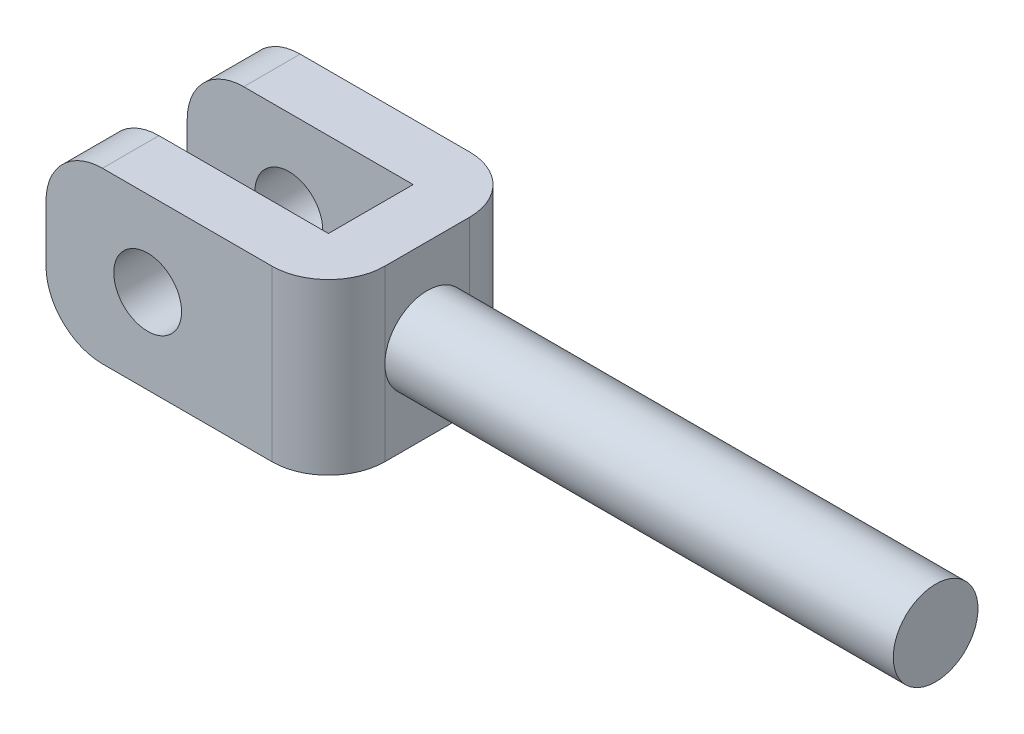
ISO-10303-21;
HEADER;
FILE_DESCRIPTION(('STEP AP214'),'2;1');
FILE_NAME('part.step','',(''),(''),'','','');
FILE_SCHEMA(('AUTOMOTIVE_DESIGN { 1 0 10303 214 1 1 1 1 }'));
ENDSEC;
DATA;
#1=APPLICATION_CONTEXT('core data for automotive mechanical design processes');
#2=APPLICATION_PROTOCOL_DEFINITION('international standard','automotive_design',2000,#1);
#3=PRODUCT_CONTEXT('',#1,'mechanical');
#4=PRODUCT('Part','Part','',(#3));
#5=PRODUCT_RELATED_PRODUCT_CATEGORY('part','',(#4));
#6=PRODUCT_DEFINITION_FORMATION('','',#4);
#7=PRODUCT_DEFINITION_CONTEXT('part definition',#1,'design');
#8=PRODUCT_DEFINITION('design','',#6,#7);
#9=PRODUCT_DEFINITION_SHAPE('','',#8);
#10=(LENGTH_UNIT() NAMED_UNIT(*) SI_UNIT(.MILLI.,.METRE.));
#11=(NAMED_UNIT(*) PLANE_ANGLE_UNIT() SI_UNIT($,.RADIAN.));
#12=(NAMED_UNIT(*) SI_UNIT($,.STERADIAN.) SOLID_ANGLE_UNIT());
#13=UNCERTAINTY_MEASURE_WITH_UNIT(LENGTH_MEASURE(1.E-05),#10,'distance_accuracy_value','');
#14=(GEOMETRIC_REPRESENTATION_CONTEXT(3) GLOBAL_UNCERTAINTY_ASSIGNED_CONTEXT((#13)) GLOBAL_UNIT_ASSIGNED_CONTEXT((#10,
#11,#12)) REPRESENTATION_CONTEXT('',''));
#15=CARTESIAN_POINT('',(0.,0.,0.));
#16=DIRECTION('',(0.,0.,1.));
#17=DIRECTION('',(1.,0.,0.));
#18=AXIS2_PLACEMENT_3D('',#15,#16,#17);
#19=CARTESIAN_POINT('',(1.,-1.5,-1.75));
#20=DIRECTION('',(1.,0.,0.));
#21=DIRECTION('',(0.,0.,-1.));
#22=AXIS2_PLACEMENT_3D('',#19,#20,#21);
#23=PLANE('',#22);
#24=DIRECTION('',(0.,0.,-1.));
#25=VECTOR('',#24,1.);
#26=CARTESIAN_POINT('',(1.,-1.5,-1.75));
#27=LINE('',#26,#25);
#28=CARTESIAN_POINT('',(1.,-1.5,0.75));
#29=VERTEX_POINT('',#28);
#30=CARTESIAN_POINT('',(1.,-1.5,-0.75));
#31=VERTEX_POINT('',#30);
#32=EDGE_CURVE('E212',#29,#31,#27,.T.);
#33=ORIENTED_EDGE('',*,*,#32,.T.);
#34=DIRECTION('',(0.,1.,0.));
#35=VECTOR('',#34,1.);
#36=CARTESIAN_POINT('',(1.,-1.5,-0.75));
#37=LINE('',#36,#35);
#38=CARTESIAN_POINT('',(0.999999999999999,0.,-0.75));
#39=VERTEX_POINT('',#38);
#40=EDGE_CURVE('E11',#31,#39,#37,.T.);
#41=ORIENTED_EDGE('',*,*,#40,.T.);
#42=CARTESIAN_POINT('',(0.999999999999999,0.,0.));
#43=DIRECTION('',(1.,0.,0.));
#44=DIRECTION('',(0.,0.,-1.));
#45=AXIS2_PLACEMENT_3D('',#42,#43,#44);
#46=CIRCLE('',#45,0.75);
#47=CARTESIAN_POINT('',(0.999999999999999,0.,0.75));
#48=VERTEX_POINT('',#47);
#49=EDGE_CURVE('E223',#48,#39,#46,.T.);
#50=ORIENTED_EDGE('',*,*,#49,.F.);
#51=DIRECTION('',(0.,1.,0.));
#52=VECTOR('',#51,1.);
#53=CARTESIAN_POINT('',(1.,-1.5,0.75));
#54=LINE('',#53,#52);
#55=EDGE_CURVE('E315',#48,#29,#54,.F.);
#56=ORIENTED_EDGE('',*,*,#55,.T.);
#57=EDGE_LOOP('',(#33,#41,#50,#56));
#58=FACE_BOUND('',#57,.T.);
#59=ADVANCED_FACE('F43',(#58),#23,.T.);
#60=CARTESIAN_POINT('',(10.,0.,0.));
#61=DIRECTION('',(-1.,0.,0.));
#62=DIRECTION('',(0.,0.,1.));
#63=AXIS2_PLACEMENT_3D('',#60,#61,#62);
#64=CYLINDRICAL_SURFACE('',#63,0.75);
#65=EDGE_CURVE('E243',#39,#48,#46,.T.);
#66=ORIENTED_EDGE('',*,*,#65,.T.);
#67=ORIENTED_EDGE('',*,*,#49,.T.);
#68=EDGE_LOOP('',(#66,#67));
#69=FACE_BOUND('',#68,.T.);
#70=CARTESIAN_POINT('',(10.,0.,0.));
#71=DIRECTION('',(1.,0.,0.));
#72=DIRECTION('',(0.,0.,-1.));
#73=AXIS2_PLACEMENT_3D('',#70,#71,#72);
#74=CIRCLE('',#73,0.75);
#75=CARTESIAN_POINT('',(10.,0.,-0.75));
#76=VERTEX_POINT('',#75);
#77=EDGE_CURVE('E238',#76,#76,#74,.T.);
#78=ORIENTED_EDGE('',*,*,#77,.F.);
#79=EDGE_LOOP('',(#78));
#80=FACE_BOUND('',#79,.T.);
#81=ADVANCED_FACE('F357',(#69,#80),#64,.T.);
#82=CARTESIAN_POINT('',(10.,0.,0.));
#83=DIRECTION('',(1.,0.,0.));
#84=DIRECTION('',(0.,0.,-1.));
#85=AXIS2_PLACEMENT_3D('',#82,#83,#84);
#86=PLANE('',#85);
#87=ORIENTED_EDGE('',*,*,#77,.T.);
#88=EDGE_LOOP('',(#87));
#89=FACE_BOUND('',#88,.T.);
#90=ADVANCED_FACE('F364',(#89),#86,.T.);
#91=CARTESIAN_POINT('',(0.,-1.5,-0.75));
#92=DIRECTION('',(0.,0.,1.));
#93=DIRECTION('',(1.,0.,0.));
#94=AXIS2_PLACEMENT_3D('',#91,#92,#93);
#95=PLANE('',#94);
#96=CARTESIAN_POINT('',(-2.2,0.,-0.75));
#97=DIRECTION('',(0.,0.,1.));
#98=DIRECTION('',(1.,0.,0.));
#99=AXIS2_PLACEMENT_3D('',#96,#97,#98);
#100=CIRCLE('',#99,0.6);
#101=CARTESIAN_POINT('',(-1.6,0.,-0.75));
#102=VERTEX_POINT('',#101);
#103=EDGE_CURVE('E166',#102,#102,#100,.T.);
#104=ORIENTED_EDGE('',*,*,#103,.F.);
#105=EDGE_LOOP('',(#104));
#106=FACE_BOUND('',#105,.T.);
#107=DIRECTION('',(1.,0.,0.));
#108=VECTOR('',#107,1.);
#109=CARTESIAN_POINT('',(0.,1.5,-0.75));
#110=LINE('',#109,#108);
#111=CARTESIAN_POINT('',(-3.,1.5,-0.75));
#112=VERTEX_POINT('',#111);
#113=CARTESIAN_POINT('',(0.,1.5,-0.75));
#114=VERTEX_POINT('',#113);
#115=EDGE_CURVE('E154',#112,#114,#110,.T.);
#116=ORIENTED_EDGE('',*,*,#115,.F.);
#117=CARTESIAN_POINT('',(-3.,0.5,-0.75));
#118=DIRECTION('',(0.,0.,1.));
#119=DIRECTION('',(1.,0.,0.));
#120=AXIS2_PLACEMENT_3D('',#117,#118,#119);
#121=CIRCLE('',#120,1.);
#122=CARTESIAN_POINT('',(-4.,0.5,-0.75));
#123=VERTEX_POINT('',#122);
#124=EDGE_CURVE('E261',#112,#123,#121,.T.);
#125=ORIENTED_EDGE('',*,*,#124,.T.);
#126=DIRECTION('',(0.,1.,0.));
#127=VECTOR('',#126,1.);
#128=CARTESIAN_POINT('',(-4.,-1.5,-0.75));
#129=LINE('',#128,#127);
#130=CARTESIAN_POINT('',(-4.,-0.5,-0.75));
#131=VERTEX_POINT('',#130);
#132=EDGE_CURVE('E219',#131,#123,#129,.T.);
#133=ORIENTED_EDGE('',*,*,#132,.F.);
#134=CARTESIAN_POINT('',(-3.,-0.5,-0.75));
#135=DIRECTION('',(0.,0.,1.));
#136=DIRECTION('',(1.,0.,0.));
#137=AXIS2_PLACEMENT_3D('',#134,#135,#136);
#138=CIRCLE('',#137,1.);
#139=CARTESIAN_POINT('',(-3.,-1.5,-0.75));
#140=VERTEX_POINT('',#139);
#141=EDGE_CURVE('E258',#131,#140,#138,.T.);
#142=ORIENTED_EDGE('',*,*,#141,.T.);
#143=DIRECTION('',(1.,0.,0.));
#144=VECTOR('',#143,1.);
#145=CARTESIAN_POINT('',(0.,-1.5,-0.75));
#146=LINE('',#145,#144);
#147=CARTESIAN_POINT('',(0.,-1.5,-0.75));
#148=VERTEX_POINT('',#147);
#149=EDGE_CURVE('E172',#140,#148,#146,.T.);
#150=ORIENTED_EDGE('',*,*,#149,.T.);
#151=DIRECTION('',(0.,1.,0.));
#152=VECTOR('',#151,1.);
#153=CARTESIAN_POINT('',(0.,-1.5,-0.75));
#154=LINE('',#153,#152);
#155=EDGE_CURVE('E169',#148,#114,#154,.T.);
#156=ORIENTED_EDGE('',*,*,#155,.T.);
#157=EDGE_LOOP('',(#116,#125,#133,#142,#150,#156));
#158=FACE_BOUND('',#157,.T.);
#159=ADVANCED_FACE('F170',(#106,#158),#95,.T.);
#160=CARTESIAN_POINT('',(-4.,-1.5,-1.75));
#161=DIRECTION('',(-1.,0.,0.));
#162=DIRECTION('',(0.,0.,1.));
#163=AXIS2_PLACEMENT_3D('',#160,#161,#162);
#164=PLANE('',#163);
#165=ORIENTED_EDGE('',*,*,#132,.T.);
#166=DIRECTION('',(0.,0.,1.));
#167=VECTOR('',#166,1.);
#168=CARTESIAN_POINT('',(-4.,0.5,-1.75));
#169=LINE('',#168,#167);
#170=CARTESIAN_POINT('',(-4.,0.5,-1.75));
#171=VERTEX_POINT('',#170);
#172=EDGE_CURVE('E268',#123,#171,#169,.F.);
#173=ORIENTED_EDGE('',*,*,#172,.T.);
#174=DIRECTION('',(0.,1.,0.));
#175=VECTOR('',#174,1.);
#176=CARTESIAN_POINT('',(-4.,-1.5,-1.75));
#177=LINE('',#176,#175);
#178=CARTESIAN_POINT('',(-4.,-0.5,-1.75));
#179=VERTEX_POINT('',#178);
#180=EDGE_CURVE('E224',#179,#171,#177,.T.);
#181=ORIENTED_EDGE('',*,*,#180,.F.);
#182=DIRECTION('',(0.,0.,1.));
#183=VECTOR('',#182,1.);
#184=CARTESIAN_POINT('',(-4.,-0.5,-0.75));
#185=LINE('',#184,#183);
#186=EDGE_CURVE('E264',#179,#131,#185,.T.);
#187=ORIENTED_EDGE('',*,*,#186,.T.);
#188=EDGE_LOOP('',(#165,#173,#181,#187));
#189=FACE_BOUND('',#188,.T.);
#190=ADVANCED_FACE('F340',(#189),#164,.T.);
#191=CARTESIAN_POINT('',(1.,-1.5,-1.75));
#192=DIRECTION('',(0.,0.,-1.));
#193=DIRECTION('',(-1.,0.,0.));
#194=AXIS2_PLACEMENT_3D('',#191,#192,#193);
#195=PLANE('',#194);
#196=CARTESIAN_POINT('',(-2.2,0.,-1.75));
#197=DIRECTION('',(0.,0.,-1.));
#198=DIRECTION('',(-1.,0.,0.));
#199=AXIS2_PLACEMENT_3D('',#196,#197,#198);
#200=CIRCLE('',#199,0.6);
#201=CARTESIAN_POINT('',(-2.8,0.,-1.75));
#202=VERTEX_POINT('',#201);
#203=EDGE_CURVE('E408',#202,#202,#200,.T.);
#204=ORIENTED_EDGE('',*,*,#203,.F.);
#205=EDGE_LOOP('',(#204));
#206=FACE_BOUND('',#205,.T.);
#207=ORIENTED_EDGE('',*,*,#180,.T.);
#208=CARTESIAN_POINT('',(-3.,0.5,-1.75));
#209=DIRECTION('',(0.,0.,-1.));
#210=DIRECTION('',(-1.,0.,0.));
#211=AXIS2_PLACEMENT_3D('',#208,#209,#210);
#212=CIRCLE('',#211,1.);
#213=CARTESIAN_POINT('',(-3.,1.5,-1.75));
#214=VERTEX_POINT('',#213);
#215=EDGE_CURVE('E277',#171,#214,#212,.T.);
#216=ORIENTED_EDGE('',*,*,#215,.T.);
#217=DIRECTION('',(-1.,0.,0.));
#218=VECTOR('',#217,1.);
#219=CARTESIAN_POINT('',(1.,1.5,-1.75));
#220=LINE('',#219,#218);
#221=CARTESIAN_POINT('',(0.,1.5,-1.75));
#222=VERTEX_POINT('',#221);
#223=EDGE_CURVE('E196',#222,#214,#220,.T.);
#224=ORIENTED_EDGE('',*,*,#223,.F.);
#225=DIRECTION('',(0.,1.,0.));
#226=VECTOR('',#225,1.);
#227=CARTESIAN_POINT('',(0.,-1.5,-1.75));
#228=LINE('',#227,#226);
#229=CARTESIAN_POINT('',(0.,-1.5,-1.75));
#230=VERTEX_POINT('',#229);
#231=EDGE_CURVE('E271',#222,#230,#228,.F.);
#232=ORIENTED_EDGE('',*,*,#231,.T.);
#233=DIRECTION('',(-1.,0.,0.));
#234=VECTOR('',#233,1.);
#235=CARTESIAN_POINT('',(1.,-1.5,-1.75));
#236=LINE('',#235,#234);
#237=CARTESIAN_POINT('',(-3.,-1.5,-1.75));
#238=VERTEX_POINT('',#237);
#239=EDGE_CURVE('E178',#230,#238,#236,.T.);
#240=ORIENTED_EDGE('',*,*,#239,.T.);
#241=CARTESIAN_POINT('',(-3.,-0.5,-1.75));
#242=DIRECTION('',(0.,0.,-1.));
#243=DIRECTION('',(-1.,0.,0.));
#244=AXIS2_PLACEMENT_3D('',#241,#242,#243);
#245=CIRCLE('',#244,1.);
#246=EDGE_CURVE('E274',#238,#179,#245,.T.);
#247=ORIENTED_EDGE('',*,*,#246,.T.);
#248=EDGE_LOOP('',(#207,#216,#224,#232,#240,#247));
#249=FACE_BOUND('',#248,.T.);
#250=ADVANCED_FACE('F328',(#206,#249),#195,.T.);
#251=ORIENTED_EDGE('',*,*,#65,.F.);
#252=DIRECTION('',(0.,1.,0.));
#253=VECTOR('',#252,1.);
#254=CARTESIAN_POINT('',(1.,-1.5,-0.75));
#255=LINE('',#254,#253);
#256=CARTESIAN_POINT('',(1.,1.5,-0.75));
#257=VERTEX_POINT('',#256);
#258=EDGE_CURVE('E53',#39,#257,#255,.T.);
#259=ORIENTED_EDGE('',*,*,#258,.T.);
#260=DIRECTION('',(0.,0.,-1.));
#261=VECTOR('',#260,1.);
#262=CARTESIAN_POINT('',(1.,1.5,-1.75));
#263=LINE('',#262,#261);
#264=CARTESIAN_POINT('',(1.,1.5,0.75));
#265=VERTEX_POINT('',#264);
#266=EDGE_CURVE('E192',#265,#257,#263,.T.);
#267=ORIENTED_EDGE('',*,*,#266,.F.);
#268=DIRECTION('',(0.,1.,0.));
#269=VECTOR('',#268,1.);
#270=CARTESIAN_POINT('',(1.,-1.5,0.75));
#271=LINE('',#270,#269);
#272=EDGE_CURVE('E60',#265,#48,#271,.F.);
#273=ORIENTED_EDGE('',*,*,#272,.T.);
#274=EDGE_LOOP('',(#251,#259,#267,#273));
#275=FACE_BOUND('',#274,.T.);
#276=ADVANCED_FACE('F321',(#275),#23,.T.);
#277=CARTESIAN_POINT('',(1.,-1.5,1.75));
#278=DIRECTION('',(0.,0.,1.));
#279=DIRECTION('',(1.,0.,0.));
#280=AXIS2_PLACEMENT_3D('',#277,#278,#279);
#281=PLANE('',#280);
#282=CARTESIAN_POINT('',(-2.2,0.,1.75));
#283=DIRECTION('',(0.,0.,1.));
#284=DIRECTION('',(1.,0.,0.));
#285=AXIS2_PLACEMENT_3D('',#282,#283,#284);
#286=CIRCLE('',#285,0.6);
#287=CARTESIAN_POINT('',(-1.6,0.,1.75));
#288=VERTEX_POINT('',#287);
#289=EDGE_CURVE('E403',#288,#288,#286,.T.);
#290=ORIENTED_EDGE('',*,*,#289,.F.);
#291=EDGE_LOOP('',(#290));
#292=FACE_BOUND('',#291,.T.);
#293=DIRECTION('',(0.,1.,0.));
#294=VECTOR('',#293,1.);
#295=CARTESIAN_POINT('',(-4.,-1.5,1.75));
#296=LINE('',#295,#294);
#297=CARTESIAN_POINT('',(-4.,-0.5,1.75));
#298=VERTEX_POINT('',#297);
#299=CARTESIAN_POINT('',(-4.,0.5,1.75));
#300=VERTEX_POINT('',#299);
#301=EDGE_CURVE('E228',#298,#300,#296,.T.);
#302=ORIENTED_EDGE('',*,*,#301,.F.);
#303=CARTESIAN_POINT('',(-3.,-0.5,1.75));
#304=DIRECTION('',(0.,0.,1.));
#305=DIRECTION('',(1.,0.,0.));
#306=AXIS2_PLACEMENT_3D('',#303,#304,#305);
#307=CIRCLE('',#306,1.);
#308=CARTESIAN_POINT('',(-3.,-1.5,1.75));
#309=VERTEX_POINT('',#308);
#310=EDGE_CURVE('E306',#298,#309,#307,.T.);
#311=ORIENTED_EDGE('',*,*,#310,.T.);
#312=DIRECTION('',(1.,0.,0.));
#313=VECTOR('',#312,1.);
#314=CARTESIAN_POINT('',(1.,-1.5,1.75));
#315=LINE('',#314,#313);
#316=CARTESIAN_POINT('',(0.,-1.5,1.75));
#317=VERTEX_POINT('',#316);
#318=EDGE_CURVE('E208',#309,#317,#315,.T.);
#319=ORIENTED_EDGE('',*,*,#318,.T.);
#320=DIRECTION('',(0.,1.,0.));
#321=VECTOR('',#320,1.);
#322=CARTESIAN_POINT('',(0.,-1.5,1.75));
#323=LINE('',#322,#321);
#324=CARTESIAN_POINT('',(0.,1.5,1.75));
#325=VERTEX_POINT('',#324);
#326=EDGE_CURVE('E299',#317,#325,#323,.T.);
#327=ORIENTED_EDGE('',*,*,#326,.T.);
#328=DIRECTION('',(1.,0.,0.));
#329=VECTOR('',#328,1.);
#330=CARTESIAN_POINT('',(1.,1.5,1.75));
#331=LINE('',#330,#329);
#332=CARTESIAN_POINT('',(-3.,1.5,1.75));
#333=VERTEX_POINT('',#332);
#334=EDGE_CURVE('E185',#333,#325,#331,.T.);
#335=ORIENTED_EDGE('',*,*,#334,.F.);
#336=CARTESIAN_POINT('',(-3.,0.5,1.75));
#337=DIRECTION('',(0.,0.,1.));
#338=DIRECTION('',(1.,0.,0.));
#339=AXIS2_PLACEMENT_3D('',#336,#337,#338);
#340=CIRCLE('',#339,1.);
#341=EDGE_CURVE('E303',#333,#300,#340,.T.);
#342=ORIENTED_EDGE('',*,*,#341,.T.);
#343=EDGE_LOOP('',(#302,#311,#319,#327,#335,#342));
#344=FACE_BOUND('',#343,.T.);
#345=ADVANCED_FACE('F369',(#292,#344),#281,.T.);
#346=CARTESIAN_POINT('',(-4.,-1.5,0.750000000000001));
#347=DIRECTION('',(-1.,0.,0.));
#348=DIRECTION('',(0.,0.,1.));
#349=AXIS2_PLACEMENT_3D('',#346,#347,#348);
#350=PLANE('',#349);
#351=DIRECTION('',(0.,1.,0.));
#352=VECTOR('',#351,1.);
#353=CARTESIAN_POINT('',(-4.,-1.5,0.750000000000001));
#354=LINE('',#353,#352);
#355=CARTESIAN_POINT('',(-4.,-0.5,0.750000000000001));
#356=VERTEX_POINT('',#355);
#357=CARTESIAN_POINT('',(-4.,0.5,0.750000000000001));
#358=VERTEX_POINT('',#357);
#359=EDGE_CURVE('E232',#356,#358,#354,.T.);
#360=ORIENTED_EDGE('',*,*,#359,.F.);
#361=DIRECTION('',(0.,0.,1.));
#362=VECTOR('',#361,1.);
#363=CARTESIAN_POINT('',(-4.,-0.5,1.75));
#364=LINE('',#363,#362);
#365=EDGE_CURVE('E295',#356,#298,#364,.T.);
#366=ORIENTED_EDGE('',*,*,#365,.T.);
#367=ORIENTED_EDGE('',*,*,#301,.T.);
#368=DIRECTION('',(0.,0.,1.));
#369=VECTOR('',#368,1.);
#370=CARTESIAN_POINT('',(-4.,0.5,0.750000000000001));
#371=LINE('',#370,#369);
#372=EDGE_CURVE('E292',#300,#358,#371,.F.);
#373=ORIENTED_EDGE('',*,*,#372,.T.);
#374=EDGE_LOOP('',(#360,#366,#367,#373));
#375=FACE_BOUND('',#374,.T.);
#376=ADVANCED_FACE('F375',(#375),#350,.T.);
#377=CARTESIAN_POINT('',(-4.,-1.5,0.750000000000001));
#378=DIRECTION('',(0.,0.,-1.));
#379=DIRECTION('',(-1.,0.,0.));
#380=AXIS2_PLACEMENT_3D('',#377,#378,#379);
#381=PLANE('',#380);
#382=CARTESIAN_POINT('',(-2.2,0.,0.75));
#383=DIRECTION('',(0.,0.,-1.));
#384=DIRECTION('',(-1.,0.,0.));
#385=AXIS2_PLACEMENT_3D('',#382,#383,#384);
#386=CIRCLE('',#385,0.6);
#387=CARTESIAN_POINT('',(-2.8,0.,0.75));
#388=VERTEX_POINT('',#387);
#389=EDGE_CURVE('E47',#388,#388,#386,.T.);
#390=ORIENTED_EDGE('',*,*,#389,.F.);
#391=EDGE_LOOP('',(#390));
#392=FACE_BOUND('',#391,.T.);
#393=DIRECTION('',(-1.,0.,0.));
#394=VECTOR('',#393,1.);
#395=CARTESIAN_POINT('',(-4.,-1.5,0.750000000000001));
#396=LINE('',#395,#394);
#397=CARTESIAN_POINT('',(0.,-1.5,0.75));
#398=VERTEX_POINT('',#397);
#399=CARTESIAN_POINT('',(-3.,-1.5,0.750000000000001));
#400=VERTEX_POINT('',#399);
#401=EDGE_CURVE('E204',#398,#400,#396,.T.);
#402=ORIENTED_EDGE('',*,*,#401,.T.);
#403=CARTESIAN_POINT('',(-3.,-0.5,0.750000000000001));
#404=DIRECTION('',(0.,0.,-1.));
#405=DIRECTION('',(-1.,0.,0.));
#406=AXIS2_PLACEMENT_3D('',#403,#404,#405);
#407=CIRCLE('',#406,1.);
#408=EDGE_CURVE('E312',#400,#356,#407,.T.);
#409=ORIENTED_EDGE('',*,*,#408,.T.);
#410=ORIENTED_EDGE('',*,*,#359,.T.);
#411=CARTESIAN_POINT('',(-3.,0.5,0.750000000000001));
#412=DIRECTION('',(0.,0.,-1.));
#413=DIRECTION('',(-1.,0.,0.));
#414=AXIS2_PLACEMENT_3D('',#411,#412,#413);
#415=CIRCLE('',#414,1.);
#416=CARTESIAN_POINT('',(-3.,1.5,0.750000000000001));
#417=VERTEX_POINT('',#416);
#418=EDGE_CURVE('E309',#358,#417,#415,.T.);
#419=ORIENTED_EDGE('',*,*,#418,.T.);
#420=DIRECTION('',(-1.,0.,0.));
#421=VECTOR('',#420,1.);
#422=CARTESIAN_POINT('',(-4.,1.5,0.750000000000001));
#423=LINE('',#422,#421);
#424=CARTESIAN_POINT('',(0.,1.5,0.75));
#425=VERTEX_POINT('',#424);
#426=EDGE_CURVE('E182',#425,#417,#423,.T.);
#427=ORIENTED_EDGE('',*,*,#426,.F.);
#428=DIRECTION('',(0.,1.,0.));
#429=VECTOR('',#428,1.);
#430=CARTESIAN_POINT('',(0.,-1.5,0.75));
#431=LINE('',#430,#429);
#432=EDGE_CURVE('E177',#398,#425,#431,.T.);
#433=ORIENTED_EDGE('',*,*,#432,.F.);
#434=EDGE_LOOP('',(#402,#409,#410,#419,#427,#433));
#435=FACE_BOUND('',#434,.T.);
#436=ADVANCED_FACE('F387',(#392,#435),#381,.T.);
#437=CARTESIAN_POINT('',(0.,-1.5,0.));
#438=DIRECTION('',(0.,1.,0.));
#439=DIRECTION('',(0.,0.,1.));
#440=AXIS2_PLACEMENT_3D('',#437,#438,#439);
#441=PLANE('',#440);
#442=ORIENTED_EDGE('',*,*,#149,.F.);
#443=DIRECTION('',(0.,0.,1.));
#444=VECTOR('',#443,1.);
#445=CARTESIAN_POINT('',(-3.,-1.5,-1.75));
#446=LINE('',#445,#444);
#447=EDGE_CURVE('E289',#140,#238,#446,.F.);
#448=ORIENTED_EDGE('',*,*,#447,.T.);
#449=ORIENTED_EDGE('',*,*,#239,.F.);
#450=CARTESIAN_POINT('',(0.,-1.5,-0.75));
#451=DIRECTION('',(0.,1.,0.));
#452=DIRECTION('',(0.,0.,1.));
#453=AXIS2_PLACEMENT_3D('',#450,#451,#452);
#454=CIRCLE('',#453,1.);
#455=EDGE_CURVE('E283',#230,#31,#454,.F.);
#456=ORIENTED_EDGE('',*,*,#455,.T.);
#457=ORIENTED_EDGE('',*,*,#32,.F.);
#458=CARTESIAN_POINT('',(0.,-1.5,0.75));
#459=DIRECTION('',(0.,1.,0.));
#460=DIRECTION('',(0.,0.,1.));
#461=AXIS2_PLACEMENT_3D('',#458,#459,#460);
#462=CIRCLE('',#461,1.);
#463=EDGE_CURVE('E280',#29,#317,#462,.F.);
#464=ORIENTED_EDGE('',*,*,#463,.T.);
#465=ORIENTED_EDGE('',*,*,#318,.F.);
#466=DIRECTION('',(0.,0.,1.));
#467=VECTOR('',#466,1.);
#468=CARTESIAN_POINT('',(-3.,-1.5,0.750000000000001));
#469=LINE('',#468,#467);
#470=EDGE_CURVE('E286',#309,#400,#469,.F.);
#471=ORIENTED_EDGE('',*,*,#470,.T.);
#472=ORIENTED_EDGE('',*,*,#401,.F.);
#473=DIRECTION('',(0.,0.,1.));
#474=VECTOR('',#473,1.);
#475=CARTESIAN_POINT('',(0.,-1.5,-0.75));
#476=LINE('',#475,#474);
#477=EDGE_CURVE('E201',#148,#398,#476,.T.);
#478=ORIENTED_EDGE('',*,*,#477,.F.);
#479=EDGE_LOOP('',(#442,#448,#449,#456,#457,#464,#465,#471,#472,#478));
#480=FACE_BOUND('',#479,.T.);
#481=ADVANCED_FACE('F331',(#480),#441,.F.);
#482=CARTESIAN_POINT('',(0.,1.5,0.));
#483=DIRECTION('',(0.,1.,0.));
#484=DIRECTION('',(0.,0.,1.));
#485=AXIS2_PLACEMENT_3D('',#482,#483,#484);
#486=PLANE('',#485);
#487=ORIENTED_EDGE('',*,*,#223,.T.);
#488=DIRECTION('',(0.,0.,1.));
#489=VECTOR('',#488,1.);
#490=CARTESIAN_POINT('',(-3.,1.5,0.));
#491=LINE('',#490,#489);
#492=EDGE_CURVE('E163',#214,#112,#491,.T.);
#493=ORIENTED_EDGE('',*,*,#492,.T.);
#494=ORIENTED_EDGE('',*,*,#115,.T.);
#495=DIRECTION('',(0.,0.,1.));
#496=VECTOR('',#495,1.);
#497=CARTESIAN_POINT('',(0.,1.5,-0.75));
#498=LINE('',#497,#496);
#499=EDGE_CURVE('E160',#114,#425,#498,.T.);
#500=ORIENTED_EDGE('',*,*,#499,.T.);
#501=ORIENTED_EDGE('',*,*,#426,.T.);
#502=DIRECTION('',(0.,0.,1.));
#503=VECTOR('',#502,1.);
#504=CARTESIAN_POINT('',(-3.,1.5,0.));
#505=LINE('',#504,#503);
#506=EDGE_CURVE('E252',#417,#333,#505,.T.);
#507=ORIENTED_EDGE('',*,*,#506,.T.);
#508=ORIENTED_EDGE('',*,*,#334,.T.);
#509=CARTESIAN_POINT('',(0.,1.5,0.75));
#510=DIRECTION('',(0.,1.,0.));
#511=DIRECTION('',(0.,0.,1.));
#512=AXIS2_PLACEMENT_3D('',#509,#510,#511);
#513=CIRCLE('',#512,1.);
#514=EDGE_CURVE('E242',#325,#265,#513,.T.);
#515=ORIENTED_EDGE('',*,*,#514,.T.);
#516=ORIENTED_EDGE('',*,*,#266,.T.);
#517=CARTESIAN_POINT('',(0.,1.5,-0.75));
#518=DIRECTION('',(0.,1.,0.));
#519=DIRECTION('',(0.,0.,1.));
#520=AXIS2_PLACEMENT_3D('',#517,#518,#519);
#521=CIRCLE('',#520,1.);
#522=EDGE_CURVE('E249',#257,#222,#521,.T.);
#523=ORIENTED_EDGE('',*,*,#522,.T.);
#524=EDGE_LOOP('',(#487,#493,#494,#500,#501,#507,#508,#515,#516,#523));
#525=FACE_BOUND('',#524,.T.);
#526=ADVANCED_FACE('F157',(#525),#486,.T.);
#527=CARTESIAN_POINT('',(0.,0.,0.));
#528=DIRECTION('',(1.,0.,0.));
#529=DIRECTION('',(0.,0.,-1.));
#530=AXIS2_PLACEMENT_3D('',#527,#528,#529);
#531=PLANE('',#530);
#532=ORIENTED_EDGE('',*,*,#477,.T.);
#533=ORIENTED_EDGE('',*,*,#432,.T.);
#534=ORIENTED_EDGE('',*,*,#499,.F.);
#535=ORIENTED_EDGE('',*,*,#155,.F.);
#536=EDGE_LOOP('',(#532,#533,#534,#535));
#537=FACE_BOUND('',#536,.T.);
#538=ADVANCED_FACE('F180',(#537),#531,.F.);
#539=CARTESIAN_POINT('',(-3.,0.5,0.));
#540=DIRECTION('',(0.,0.,1.));
#541=DIRECTION('',(1.,0.,0.));
#542=AXIS2_PLACEMENT_3D('',#539,#540,#541);
#543=CYLINDRICAL_SURFACE('',#542,1.);
#544=ORIENTED_EDGE('',*,*,#215,.F.);
#545=ORIENTED_EDGE('',*,*,#172,.F.);
#546=ORIENTED_EDGE('',*,*,#124,.F.);
#547=ORIENTED_EDGE('',*,*,#492,.F.);
#548=EDGE_LOOP('',(#544,#545,#546,#547));
#549=FACE_BOUND('',#548,.T.);
#550=ADVANCED_FACE('F344',(#549),#543,.T.);
#551=CARTESIAN_POINT('',(-3.,-0.5,-1.75));
#552=DIRECTION('',(0.,0.,-1.));
#553=DIRECTION('',(-1.,0.,0.));
#554=AXIS2_PLACEMENT_3D('',#551,#552,#553);
#555=CYLINDRICAL_SURFACE('',#554,1.);
#556=ORIENTED_EDGE('',*,*,#246,.F.);
#557=ORIENTED_EDGE('',*,*,#447,.F.);
#558=ORIENTED_EDGE('',*,*,#141,.F.);
#559=ORIENTED_EDGE('',*,*,#186,.F.);
#560=EDGE_LOOP('',(#556,#557,#558,#559));
#561=FACE_BOUND('',#560,.T.);
#562=ADVANCED_FACE('F335',(#561),#555,.T.);
#563=CARTESIAN_POINT('',(-3.,-0.5,0.750000000000001));
#564=DIRECTION('',(0.,0.,-1.));
#565=DIRECTION('',(-1.,0.,0.));
#566=AXIS2_PLACEMENT_3D('',#563,#564,#565);
#567=CYLINDRICAL_SURFACE('',#566,1.);
#568=ORIENTED_EDGE('',*,*,#408,.F.);
#569=ORIENTED_EDGE('',*,*,#470,.F.);
#570=ORIENTED_EDGE('',*,*,#310,.F.);
#571=ORIENTED_EDGE('',*,*,#365,.F.);
#572=EDGE_LOOP('',(#568,#569,#570,#571));
#573=FACE_BOUND('',#572,.T.);
#574=ADVANCED_FACE('F351',(#573),#567,.T.);
#575=CARTESIAN_POINT('',(-3.,0.5,0.));
#576=DIRECTION('',(0.,0.,1.));
#577=DIRECTION('',(1.,0.,0.));
#578=AXIS2_PLACEMENT_3D('',#575,#576,#577);
#579=CYLINDRICAL_SURFACE('',#578,1.);
#580=ORIENTED_EDGE('',*,*,#418,.F.);
#581=ORIENTED_EDGE('',*,*,#372,.F.);
#582=ORIENTED_EDGE('',*,*,#341,.F.);
#583=ORIENTED_EDGE('',*,*,#506,.F.);
#584=EDGE_LOOP('',(#580,#581,#582,#583));
#585=FACE_BOUND('',#584,.T.);
#586=ADVANCED_FACE('F450',(#585),#579,.T.);
#587=CARTESIAN_POINT('',(0.,-1.5,-0.75));
#588=DIRECTION('',(0.,1.,0.));
#589=DIRECTION('',(0.,0.,1.));
#590=AXIS2_PLACEMENT_3D('',#587,#588,#589);
#591=CYLINDRICAL_SURFACE('',#590,1.);
#592=ORIENTED_EDGE('',*,*,#455,.F.);
#593=ORIENTED_EDGE('',*,*,#231,.F.);
#594=ORIENTED_EDGE('',*,*,#522,.F.);
#595=ORIENTED_EDGE('',*,*,#258,.F.);
#596=ORIENTED_EDGE('',*,*,#40,.F.);
#597=EDGE_LOOP('',(#592,#593,#594,#595,#596));
#598=FACE_BOUND('',#597,.T.);
#599=ADVANCED_FACE('F325',(#598),#591,.T.);
#600=CARTESIAN_POINT('',(0.,-1.5,0.75));
#601=DIRECTION('',(0.,1.,0.));
#602=DIRECTION('',(0.,0.,1.));
#603=AXIS2_PLACEMENT_3D('',#600,#601,#602);
#604=CYLINDRICAL_SURFACE('',#603,1.);
#605=ORIENTED_EDGE('',*,*,#55,.F.);
#606=ORIENTED_EDGE('',*,*,#272,.F.);
#607=ORIENTED_EDGE('',*,*,#514,.F.);
#608=ORIENTED_EDGE('',*,*,#326,.F.);
#609=ORIENTED_EDGE('',*,*,#463,.F.);
#610=EDGE_LOOP('',(#605,#606,#607,#608,#609));
#611=FACE_BOUND('',#610,.T.);
#612=ADVANCED_FACE('F45',(#611),#604,.T.);
#613=CARTESIAN_POINT('',(-2.2,0.,3.25));
#614=DIRECTION('',(0.,0.,-1.));
#615=DIRECTION('',(-1.,0.,0.));
#616=AXIS2_PLACEMENT_3D('',#613,#614,#615);
#617=CYLINDRICAL_SURFACE('',#616,0.6);
#618=ORIENTED_EDGE('',*,*,#289,.T.);
#619=EDGE_LOOP('',(#618));
#620=FACE_BOUND('',#619,.T.);
#621=ORIENTED_EDGE('',*,*,#389,.T.);
#622=EDGE_LOOP('',(#621));
#623=FACE_BOUND('',#622,.T.);
#624=ADVANCED_FACE('F390',(#620,#623),#617,.F.);
#625=ORIENTED_EDGE('',*,*,#103,.T.);
#626=EDGE_LOOP('',(#625));
#627=FACE_BOUND('',#626,.T.);
#628=ORIENTED_EDGE('',*,*,#203,.T.);
#629=EDGE_LOOP('',(#628));
#630=FACE_BOUND('',#629,.T.);
#631=ADVANCED_FACE('F392',(#627,#630),#617,.F.);
#632=CLOSED_SHELL('',(#59,#81,#90,#159,#190,#250,#276,#345,#376,#436,#481,#526,#538,#550,#562,
#574,#586,#599,#612,#624,#631));
#633=MANIFOLD_SOLID_BREP('B2',#632);
#634=ADVANCED_BREP_SHAPE_REPRESENTATION('',(#18,#633),#14);
#635=SHAPE_DEFINITION_REPRESENTATION(#9,#634);
ENDSEC;
END-ISO-10303-21;
